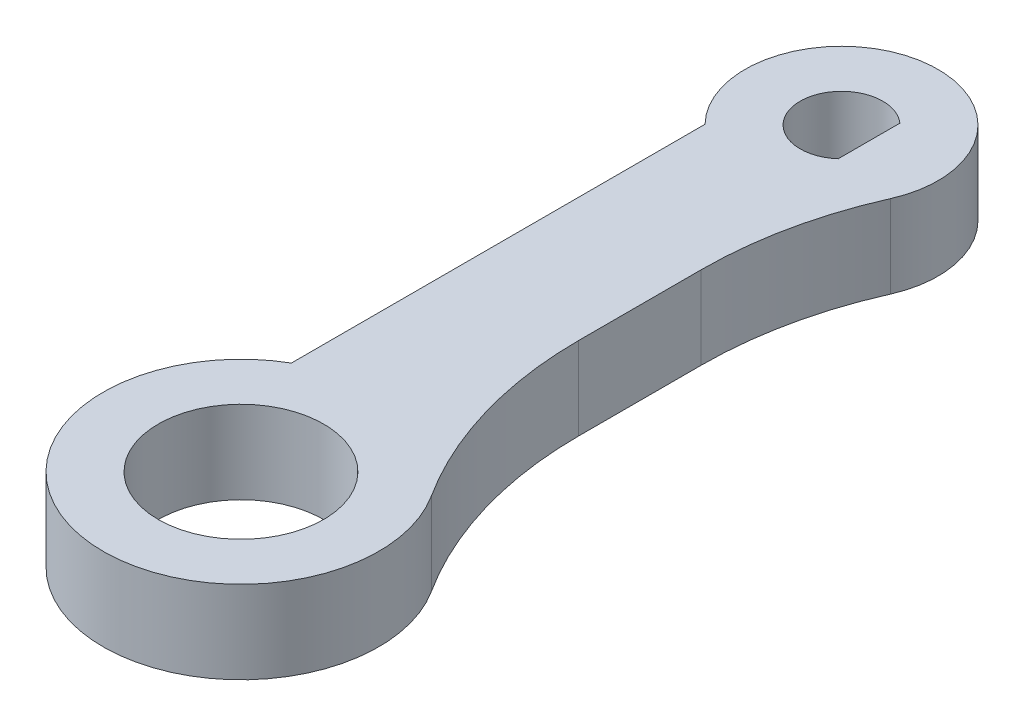
ISO-10303-21;
HEADER;
FILE_DESCRIPTION(('STEP AP214'),'2;1');
FILE_NAME('part.step','',(''),(''),'','','');
FILE_SCHEMA(('AUTOMOTIVE_DESIGN { 1 0 10303 214 1 1 1 1 }'));
ENDSEC;
DATA;
#1=APPLICATION_CONTEXT('core data for automotive mechanical design processes');
#2=APPLICATION_PROTOCOL_DEFINITION('international standard','automotive_design',2000,#1);
#3=PRODUCT_CONTEXT('',#1,'mechanical');
#4=PRODUCT('Part','Part','',(#3));
#5=PRODUCT_RELATED_PRODUCT_CATEGORY('part','',(#4));
#6=PRODUCT_DEFINITION_FORMATION('','',#4);
#7=PRODUCT_DEFINITION_CONTEXT('part definition',#1,'design');
#8=PRODUCT_DEFINITION('design','',#6,#7);
#9=PRODUCT_DEFINITION_SHAPE('','',#8);
#10=(LENGTH_UNIT() NAMED_UNIT(*) SI_UNIT(.MILLI.,.METRE.));
#11=(NAMED_UNIT(*) PLANE_ANGLE_UNIT() SI_UNIT($,.RADIAN.));
#12=(NAMED_UNIT(*) SI_UNIT($,.STERADIAN.) SOLID_ANGLE_UNIT());
#13=UNCERTAINTY_MEASURE_WITH_UNIT(LENGTH_MEASURE(1.E-05),#10,'distance_accuracy_value','');
#14=(GEOMETRIC_REPRESENTATION_CONTEXT(3) GLOBAL_UNCERTAINTY_ASSIGNED_CONTEXT((#13)) GLOBAL_UNIT_ASSIGNED_CONTEXT((#10,
#11,#12)) REPRESENTATION_CONTEXT('',''));
#15=CARTESIAN_POINT('',(0.,0.,0.));
#16=DIRECTION('',(0.,0.,1.));
#17=DIRECTION('',(1.,0.,0.));
#18=AXIS2_PLACEMENT_3D('',#15,#16,#17);
#19=CARTESIAN_POINT('',(0.,0.,0.));
#20=DIRECTION('',(0.,1.,0.));
#21=DIRECTION('',(0.,0.,1.));
#22=AXIS2_PLACEMENT_3D('',#19,#20,#21);
#23=PLANE('',#22);
#24=CARTESIAN_POINT('',(0.,0.,0.));
#25=DIRECTION('',(0.,1.,0.));
#26=DIRECTION('',(0.,0.,1.));
#27=AXIS2_PLACEMENT_3D('',#24,#25,#26);
#28=CIRCLE('',#27,1.5);
#29=CARTESIAN_POINT('',(1.,0.,-1.11803398874989));
#30=VERTEX_POINT('',#29);
#31=CARTESIAN_POINT('',(1.,0.,1.11803398874989));
#32=VERTEX_POINT('',#31);
#33=EDGE_CURVE('E141',#30,#32,#28,.T.);
#34=ORIENTED_EDGE('',*,*,#33,.T.);
#35=DIRECTION('',(0.,0.,1.));
#36=VECTOR('',#35,1.);
#37=CARTESIAN_POINT('',(1.,0.,0.));
#38=LINE('',#37,#36);
#39=EDGE_CURVE('E166',#30,#32,#38,.T.);
#40=ORIENTED_EDGE('',*,*,#39,.F.);
#41=EDGE_LOOP('',(#34,#40));
#42=FACE_BOUND('',#41,.T.);
#43=CARTESIAN_POINT('',(0.,0.,21.7796167617054));
#44=DIRECTION('',(0.,1.,0.));
#45=DIRECTION('',(0.,0.,1.));
#46=AXIS2_PLACEMENT_3D('',#43,#44,#45);
#47=CIRCLE('',#46,3.);
#48=CARTESIAN_POINT('',(0.,0.,24.7796167617054));
#49=VERTEX_POINT('',#48);
#50=EDGE_CURVE('E151',#49,#49,#47,.T.);
#51=ORIENTED_EDGE('',*,*,#50,.T.);
#52=EDGE_LOOP('',(#51));
#53=FACE_BOUND('',#52,.T.);
#54=CARTESIAN_POINT('',(0.,0.,0.));
#55=DIRECTION('',(0.,1.,0.));
#56=DIRECTION('',(0.,0.,1.));
#57=AXIS2_PLACEMENT_3D('',#54,#55,#56);
#58=CIRCLE('',#57,3.5);
#59=CARTESIAN_POINT('',(3.2,0.,1.41774468787578));
#60=VERTEX_POINT('',#59);
#61=CARTESIAN_POINT('',(-2.5,0.,2.44948974278318));
#62=VERTEX_POINT('',#61);
#63=EDGE_CURVE('E160',#60,#62,#58,.T.);
#64=ORIENTED_EDGE('',*,*,#63,.F.);
#65=CARTESIAN_POINT('',(16.,0.,7.08872343937892));
#66=DIRECTION('',(0.,1.,0.));
#67=DIRECTION('',(0.,0.,1.));
#68=AXIS2_PLACEMENT_3D('',#65,#66,#67);
#69=CIRCLE('',#68,14.);
#70=CARTESIAN_POINT('',(2.,0.,7.08872343937892));
#71=VERTEX_POINT('',#70);
#72=EDGE_CURVE('E184',#60,#71,#69,.T.);
#73=ORIENTED_EDGE('',*,*,#72,.T.);
#74=DIRECTION('',(0.,0.,-1.));
#75=VECTOR('',#74,1.);
#76=CARTESIAN_POINT('',(2.,0.,0.));
#77=LINE('',#76,#75);
#78=CARTESIAN_POINT('',(2.,0.,11.5326659957458));
#79=VERTEX_POINT('',#78);
#80=EDGE_CURVE('E198',#79,#71,#77,.T.);
#81=ORIENTED_EDGE('',*,*,#80,.F.);
#82=CARTESIAN_POINT('',(16.,0.,11.5326659957458));
#83=DIRECTION('',(0.,1.,0.));
#84=DIRECTION('',(0.,0.,1.));
#85=AXIS2_PLACEMENT_3D('',#82,#83,#84);
#86=CIRCLE('',#85,14.);
#87=CARTESIAN_POINT('',(4.21052631578947,0.,19.0830507706634));
#88=VERTEX_POINT('',#87);
#89=EDGE_CURVE('E68',#79,#88,#86,.T.);
#90=ORIENTED_EDGE('',*,*,#89,.T.);
#91=CARTESIAN_POINT('',(0.,0.,21.7796167617054));
#92=DIRECTION('',(0.,1.,0.));
#93=DIRECTION('',(0.,0.,1.));
#94=AXIS2_PLACEMENT_3D('',#91,#92,#93);
#95=CIRCLE('',#94,5.);
#96=CARTESIAN_POINT('',(-2.5,0.,17.4494897427832));
#97=VERTEX_POINT('',#96);
#98=EDGE_CURVE('E147',#97,#88,#95,.T.);
#99=ORIENTED_EDGE('',*,*,#98,.F.);
#100=DIRECTION('',(0.,0.,1.));
#101=VECTOR('',#100,1.);
#102=CARTESIAN_POINT('',(-2.5,0.,2.44948974278318));
#103=LINE('',#102,#101);
#104=EDGE_CURVE('E131',#62,#97,#103,.T.);
#105=ORIENTED_EDGE('',*,*,#104,.F.);
#106=EDGE_LOOP('',(#64,#73,#81,#90,#99,#105));
#107=FACE_BOUND('',#106,.T.);
#108=ADVANCED_FACE('F60',(#42,#53,#107),#23,.F.);
#109=CARTESIAN_POINT('',(0.,3.,0.));
#110=DIRECTION('',(0.,1.,0.));
#111=DIRECTION('',(0.,0.,1.));
#112=AXIS2_PLACEMENT_3D('',#109,#110,#111);
#113=PLANE('',#112);
#114=CARTESIAN_POINT('',(0.,3.,21.7796167617054));
#115=DIRECTION('',(0.,1.,0.));
#116=DIRECTION('',(0.,0.,1.));
#117=AXIS2_PLACEMENT_3D('',#114,#115,#116);
#118=CIRCLE('',#117,3.);
#119=CARTESIAN_POINT('',(0.,3.,24.7796167617054));
#120=VERTEX_POINT('',#119);
#121=EDGE_CURVE('E144',#120,#120,#118,.T.);
#122=ORIENTED_EDGE('',*,*,#121,.F.);
#123=EDGE_LOOP('',(#122));
#124=FACE_BOUND('',#123,.T.);
#125=CARTESIAN_POINT('',(0.,3.,0.));
#126=DIRECTION('',(0.,1.,0.));
#127=DIRECTION('',(0.,0.,1.));
#128=AXIS2_PLACEMENT_3D('',#125,#126,#127);
#129=CIRCLE('',#128,1.5);
#130=CARTESIAN_POINT('',(1.,3.,-1.11803398874989));
#131=VERTEX_POINT('',#130);
#132=CARTESIAN_POINT('',(1.,3.,1.11803398874989));
#133=VERTEX_POINT('',#132);
#134=EDGE_CURVE('E156',#131,#133,#129,.T.);
#135=ORIENTED_EDGE('',*,*,#134,.F.);
#136=DIRECTION('',(0.,0.,1.));
#137=VECTOR('',#136,1.);
#138=CARTESIAN_POINT('',(1.,3.,0.));
#139=LINE('',#138,#137);
#140=EDGE_CURVE('E159',#131,#133,#139,.T.);
#141=ORIENTED_EDGE('',*,*,#140,.T.);
#142=EDGE_LOOP('',(#135,#141));
#143=FACE_BOUND('',#142,.T.);
#144=CARTESIAN_POINT('',(0.,3.,21.7796167617054));
#145=DIRECTION('',(0.,1.,0.));
#146=DIRECTION('',(0.,0.,1.));
#147=AXIS2_PLACEMENT_3D('',#144,#145,#146);
#148=CIRCLE('',#147,5.);
#149=CARTESIAN_POINT('',(-2.5,3.,17.4494897427832));
#150=VERTEX_POINT('',#149);
#151=CARTESIAN_POINT('',(4.21052631578947,3.,19.0830507706634));
#152=VERTEX_POINT('',#151);
#153=EDGE_CURVE('E133',#150,#152,#148,.T.);
#154=ORIENTED_EDGE('',*,*,#153,.T.);
#155=CARTESIAN_POINT('',(16.,3.,11.5326659957458));
#156=DIRECTION('',(0.,1.,0.));
#157=DIRECTION('',(0.,0.,1.));
#158=AXIS2_PLACEMENT_3D('',#155,#156,#157);
#159=CIRCLE('',#158,14.);
#160=CARTESIAN_POINT('',(2.,3.,11.5326659957458));
#161=VERTEX_POINT('',#160);
#162=EDGE_CURVE('E12',#152,#161,#159,.F.);
#163=ORIENTED_EDGE('',*,*,#162,.T.);
#164=DIRECTION('',(0.,0.,-1.));
#165=VECTOR('',#164,1.);
#166=CARTESIAN_POINT('',(2.,3.,0.));
#167=LINE('',#166,#165);
#168=CARTESIAN_POINT('',(2.,3.,7.08872343937892));
#169=VERTEX_POINT('',#168);
#170=EDGE_CURVE('E175',#161,#169,#167,.T.);
#171=ORIENTED_EDGE('',*,*,#170,.T.);
#172=CARTESIAN_POINT('',(16.,3.,7.08872343937892));
#173=DIRECTION('',(0.,1.,0.));
#174=DIRECTION('',(0.,0.,1.));
#175=AXIS2_PLACEMENT_3D('',#172,#173,#174);
#176=CIRCLE('',#175,14.);
#177=CARTESIAN_POINT('',(3.2,3.,1.41774468787578));
#178=VERTEX_POINT('',#177);
#179=EDGE_CURVE('E186',#169,#178,#176,.F.);
#180=ORIENTED_EDGE('',*,*,#179,.T.);
#181=CARTESIAN_POINT('',(0.,3.,0.));
#182=DIRECTION('',(0.,1.,0.));
#183=DIRECTION('',(0.,0.,1.));
#184=AXIS2_PLACEMENT_3D('',#181,#182,#183);
#185=CIRCLE('',#184,3.5);
#186=CARTESIAN_POINT('',(-2.5,3.,2.44948974278318));
#187=VERTEX_POINT('',#186);
#188=EDGE_CURVE('E139',#178,#187,#185,.T.);
#189=ORIENTED_EDGE('',*,*,#188,.T.);
#190=DIRECTION('',(0.,0.,1.));
#191=VECTOR('',#190,1.);
#192=CARTESIAN_POINT('',(-2.5,3.,2.44948974278318));
#193=LINE('',#192,#191);
#194=EDGE_CURVE('E129',#187,#150,#193,.T.);
#195=ORIENTED_EDGE('',*,*,#194,.T.);
#196=EDGE_LOOP('',(#154,#163,#171,#180,#189,#195));
#197=FACE_BOUND('',#196,.T.);
#198=ADVANCED_FACE('F136',(#124,#143,#197),#113,.T.);
#199=CARTESIAN_POINT('',(0.,3.,21.7796167617054));
#200=DIRECTION('',(0.,-1.,0.));
#201=DIRECTION('',(0.,0.,-1.));
#202=AXIS2_PLACEMENT_3D('',#199,#200,#201);
#203=CYLINDRICAL_SURFACE('',#202,5.);
#204=ORIENTED_EDGE('',*,*,#98,.T.);
#205=DIRECTION('',(0.,-1.,0.));
#206=VECTOR('',#205,1.);
#207=CARTESIAN_POINT('',(4.21052631578947,3.,19.0830507706634));
#208=LINE('',#207,#206);
#209=EDGE_CURVE('E75',#88,#152,#208,.F.);
#210=ORIENTED_EDGE('',*,*,#209,.T.);
#211=ORIENTED_EDGE('',*,*,#153,.F.);
#212=DIRECTION('',(0.,-1.,0.));
#213=VECTOR('',#212,1.);
#214=CARTESIAN_POINT('',(-2.5,3.,17.4494897427832));
#215=LINE('',#214,#213);
#216=EDGE_CURVE('E125',#150,#97,#215,.T.);
#217=ORIENTED_EDGE('',*,*,#216,.T.);
#218=EDGE_LOOP('',(#204,#210,#211,#217));
#219=FACE_BOUND('',#218,.T.);
#220=ADVANCED_FACE('F143',(#219),#203,.T.);
#221=CARTESIAN_POINT('',(0.,3.,21.7796167617054));
#222=DIRECTION('',(0.,-1.,0.));
#223=DIRECTION('',(0.,0.,-1.));
#224=AXIS2_PLACEMENT_3D('',#221,#222,#223);
#225=CYLINDRICAL_SURFACE('',#224,3.);
#226=ORIENTED_EDGE('',*,*,#121,.T.);
#227=EDGE_LOOP('',(#226));
#228=FACE_BOUND('',#227,.T.);
#229=ORIENTED_EDGE('',*,*,#50,.F.);
#230=EDGE_LOOP('',(#229));
#231=FACE_BOUND('',#230,.T.);
#232=ADVANCED_FACE('F222',(#228,#231),#225,.F.);
#233=CARTESIAN_POINT('',(1.,3.,0.));
#234=DIRECTION('',(1.,0.,0.));
#235=DIRECTION('',(0.,0.,-1.));
#236=AXIS2_PLACEMENT_3D('',#233,#234,#235);
#237=PLANE('',#236);
#238=ORIENTED_EDGE('',*,*,#39,.T.);
#239=DIRECTION('',(0.,-1.,0.));
#240=VECTOR('',#239,1.);
#241=CARTESIAN_POINT('',(1.,3.,1.11803398874989));
#242=LINE('',#241,#240);
#243=EDGE_CURVE('E163',#133,#32,#242,.T.);
#244=ORIENTED_EDGE('',*,*,#243,.F.);
#245=ORIENTED_EDGE('',*,*,#140,.F.);
#246=DIRECTION('',(0.,-1.,0.));
#247=VECTOR('',#246,1.);
#248=CARTESIAN_POINT('',(1.,3.,-1.11803398874989));
#249=LINE('',#248,#247);
#250=EDGE_CURVE('E171',#131,#30,#249,.T.);
#251=ORIENTED_EDGE('',*,*,#250,.T.);
#252=EDGE_LOOP('',(#238,#244,#245,#251));
#253=FACE_BOUND('',#252,.T.);
#254=ADVANCED_FACE('F225',(#253),#237,.F.);
#255=CARTESIAN_POINT('',(0.,3.,0.));
#256=DIRECTION('',(0.,-1.,0.));
#257=DIRECTION('',(0.,0.,-1.));
#258=AXIS2_PLACEMENT_3D('',#255,#256,#257);
#259=CYLINDRICAL_SURFACE('',#258,1.5);
#260=ORIENTED_EDGE('',*,*,#33,.F.);
#261=ORIENTED_EDGE('',*,*,#250,.F.);
#262=ORIENTED_EDGE('',*,*,#134,.T.);
#263=ORIENTED_EDGE('',*,*,#243,.T.);
#264=EDGE_LOOP('',(#260,#261,#262,#263));
#265=FACE_BOUND('',#264,.T.);
#266=ADVANCED_FACE('F229',(#265),#259,.F.);
#267=CARTESIAN_POINT('',(0.,3.,0.));
#268=DIRECTION('',(0.,-1.,0.));
#269=DIRECTION('',(0.,0.,-1.));
#270=AXIS2_PLACEMENT_3D('',#267,#268,#269);
#271=CYLINDRICAL_SURFACE('',#270,3.5);
#272=ORIENTED_EDGE('',*,*,#188,.F.);
#273=DIRECTION('',(0.,-1.,0.));
#274=VECTOR('',#273,1.);
#275=CARTESIAN_POINT('',(3.2,3.,1.41774468787578));
#276=LINE('',#275,#274);
#277=EDGE_CURVE('E132',#178,#60,#276,.T.);
#278=ORIENTED_EDGE('',*,*,#277,.T.);
#279=ORIENTED_EDGE('',*,*,#63,.T.);
#280=DIRECTION('',(0.,-1.,0.));
#281=VECTOR('',#280,1.);
#282=CARTESIAN_POINT('',(-2.5,3.,2.44948974278318));
#283=LINE('',#282,#281);
#284=EDGE_CURVE('E154',#187,#62,#283,.T.);
#285=ORIENTED_EDGE('',*,*,#284,.F.);
#286=EDGE_LOOP('',(#272,#278,#279,#285));
#287=FACE_BOUND('',#286,.T.);
#288=ADVANCED_FACE('F194',(#287),#271,.T.);
#289=CARTESIAN_POINT('',(-2.5,3.,2.44948974278318));
#290=DIRECTION('',(1.,0.,0.));
#291=DIRECTION('',(0.,0.,-1.));
#292=AXIS2_PLACEMENT_3D('',#289,#290,#291);
#293=PLANE('',#292);
#294=ORIENTED_EDGE('',*,*,#104,.T.);
#295=ORIENTED_EDGE('',*,*,#216,.F.);
#296=ORIENTED_EDGE('',*,*,#194,.F.);
#297=ORIENTED_EDGE('',*,*,#284,.T.);
#298=EDGE_LOOP('',(#294,#295,#296,#297));
#299=FACE_BOUND('',#298,.T.);
#300=ADVANCED_FACE('F127',(#299),#293,.F.);
#301=CARTESIAN_POINT('',(2.,3.,0.));
#302=DIRECTION('',(-1.,0.,0.));
#303=DIRECTION('',(0.,0.,1.));
#304=AXIS2_PLACEMENT_3D('',#301,#302,#303);
#305=PLANE('',#304);
#306=ORIENTED_EDGE('',*,*,#80,.T.);
#307=DIRECTION('',(0.,1.,0.));
#308=VECTOR('',#307,1.);
#309=CARTESIAN_POINT('',(2.,3.,7.08872343937892));
#310=LINE('',#309,#308);
#311=EDGE_CURVE('E181',#71,#169,#310,.T.);
#312=ORIENTED_EDGE('',*,*,#311,.T.);
#313=ORIENTED_EDGE('',*,*,#170,.F.);
#314=DIRECTION('',(0.,1.,0.));
#315=VECTOR('',#314,1.);
#316=CARTESIAN_POINT('',(2.,0.,11.5326659957458));
#317=LINE('',#316,#315);
#318=EDGE_CURVE('E178',#161,#79,#317,.F.);
#319=ORIENTED_EDGE('',*,*,#318,.T.);
#320=EDGE_LOOP('',(#306,#312,#313,#319));
#321=FACE_BOUND('',#320,.T.);
#322=ADVANCED_FACE('F200',(#321),#305,.F.);
#323=CARTESIAN_POINT('',(16.,3.,7.08872343937892));
#324=DIRECTION('',(0.,-1.,0.));
#325=DIRECTION('',(0.,0.,-1.));
#326=AXIS2_PLACEMENT_3D('',#323,#324,#325);
#327=CYLINDRICAL_SURFACE('',#326,14.);
#328=ORIENTED_EDGE('',*,*,#179,.F.);
#329=ORIENTED_EDGE('',*,*,#311,.F.);
#330=ORIENTED_EDGE('',*,*,#72,.F.);
#331=ORIENTED_EDGE('',*,*,#277,.F.);
#332=EDGE_LOOP('',(#328,#329,#330,#331));
#333=FACE_BOUND('',#332,.T.);
#334=ADVANCED_FACE('F196',(#333),#327,.F.);
#335=CARTESIAN_POINT('',(16.,3.,11.5326659957458));
#336=DIRECTION('',(0.,-1.,0.));
#337=DIRECTION('',(0.,0.,-1.));
#338=AXIS2_PLACEMENT_3D('',#335,#336,#337);
#339=CYLINDRICAL_SURFACE('',#338,14.);
#340=ORIENTED_EDGE('',*,*,#162,.F.);
#341=ORIENTED_EDGE('',*,*,#209,.F.);
#342=ORIENTED_EDGE('',*,*,#89,.F.);
#343=ORIENTED_EDGE('',*,*,#318,.F.);
#344=EDGE_LOOP('',(#340,#341,#342,#343));
#345=FACE_BOUND('',#344,.T.);
#346=ADVANCED_FACE('F62',(#345),#339,.F.);
#347=CLOSED_SHELL('',(#108,#198,#220,#232,#254,#266,#288,#300,#322,#334,#346));
#348=MANIFOLD_SOLID_BREP('B2',#347);
#349=ADVANCED_BREP_SHAPE_REPRESENTATION('',(#18,#348),#14);
#350=SHAPE_DEFINITION_REPRESENTATION(#9,#349);
ENDSEC;
END-ISO-10303-21;
